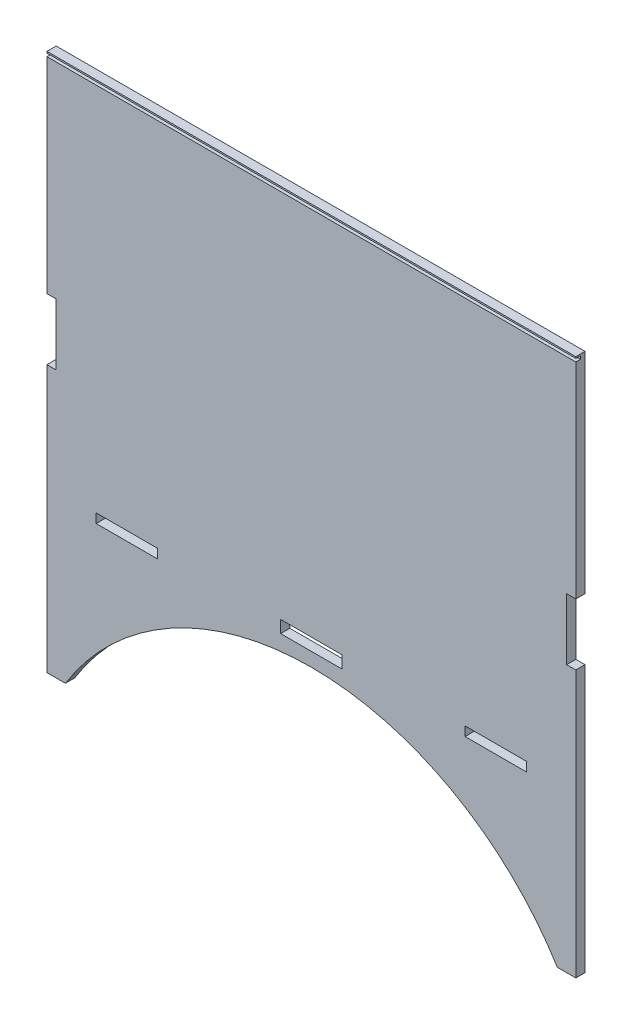
ISO-10303-21;
HEADER;
FILE_DESCRIPTION(('STEP AP214'),'2;1');
FILE_NAME('part.step','',(''),(''),'','','');
FILE_SCHEMA(('AUTOMOTIVE_DESIGN { 1 0 10303 214 1 1 1 1 }'));
ENDSEC;
DATA;
#1=APPLICATION_CONTEXT('core data for automotive mechanical design processes');
#2=APPLICATION_PROTOCOL_DEFINITION('international standard','automotive_design',2000,#1);
#3=PRODUCT_CONTEXT('',#1,'mechanical');
#4=PRODUCT('Part','Part','',(#3));
#5=PRODUCT_RELATED_PRODUCT_CATEGORY('part','',(#4));
#6=PRODUCT_DEFINITION_FORMATION('','',#4);
#7=PRODUCT_DEFINITION_CONTEXT('part definition',#1,'design');
#8=PRODUCT_DEFINITION('design','',#6,#7);
#9=PRODUCT_DEFINITION_SHAPE('','',#8);
#10=(LENGTH_UNIT() NAMED_UNIT(*) SI_UNIT(.MILLI.,.METRE.));
#11=(NAMED_UNIT(*) PLANE_ANGLE_UNIT() SI_UNIT($,.RADIAN.));
#12=(NAMED_UNIT(*) SI_UNIT($,.STERADIAN.) SOLID_ANGLE_UNIT());
#13=UNCERTAINTY_MEASURE_WITH_UNIT(LENGTH_MEASURE(1.E-05),#10,'distance_accuracy_value','');
#14=(GEOMETRIC_REPRESENTATION_CONTEXT(3) GLOBAL_UNCERTAINTY_ASSIGNED_CONTEXT((#13)) GLOBAL_UNIT_ASSIGNED_CONTEXT((#10,
#11,#12)) REPRESENTATION_CONTEXT('',''));
#15=CARTESIAN_POINT('',(0.,0.,0.));
#16=DIRECTION('',(0.,0.,1.));
#17=DIRECTION('',(1.,0.,0.));
#18=AXIS2_PLACEMENT_3D('',#15,#16,#17);
#19=CARTESIAN_POINT('',(-109.499197329278,-175.,3.));
#20=DIRECTION('',(1.,0.,0.));
#21=DIRECTION('',(0.,1.,0.));
#22=AXIS2_PLACEMENT_3D('',#19,#20,#21);
#23=PLANE('',#22);
#24=DIRECTION('',(0.,-1.,0.));
#25=VECTOR('',#24,1.);
#26=CARTESIAN_POINT('',(-109.499197329278,-175.,3.));
#27=LINE('',#26,#25);
#28=CARTESIAN_POINT('',(-109.499197329278,-88.25,3.));
#29=VERTEX_POINT('',#28);
#30=CARTESIAN_POINT('',(-109.499197329278,-175.,3.));
#31=VERTEX_POINT('',#30);
#32=EDGE_CURVE('E421',#29,#31,#27,.T.);
#33=ORIENTED_EDGE('',*,*,#32,.F.);
#34=DIRECTION('',(0.,0.,1.));
#35=VECTOR('',#34,1.);
#36=CARTESIAN_POINT('',(-109.499197329278,-88.25,0.));
#37=LINE('',#36,#35);
#38=CARTESIAN_POINT('',(-109.499197329278,-88.25,0.));
#39=VERTEX_POINT('',#38);
#40=EDGE_CURVE('E269',#39,#29,#37,.T.);
#41=ORIENTED_EDGE('',*,*,#40,.F.);
#42=DIRECTION('',(0.,-1.,0.));
#43=VECTOR('',#42,1.);
#44=CARTESIAN_POINT('',(-109.499197329278,-175.,0.));
#45=LINE('',#44,#43);
#46=CARTESIAN_POINT('',(-109.499197329278,-175.,0.));
#47=VERTEX_POINT('',#46);
#48=EDGE_CURVE('E260',#39,#47,#45,.T.);
#49=ORIENTED_EDGE('',*,*,#48,.T.);
#50=DIRECTION('',(0.,0.,-1.));
#51=VECTOR('',#50,1.);
#52=CARTESIAN_POINT('',(-109.499197329278,-175.,3.));
#53=LINE('',#52,#51);
#54=EDGE_CURVE('E11',#31,#47,#53,.T.);
#55=ORIENTED_EDGE('',*,*,#54,.F.);
#56=EDGE_LOOP('',(#33,#41,#49,#55));
#57=FACE_BOUND('',#56,.T.);
#58=ADVANCED_FACE('F39',(#57),#23,.F.);
#59=CARTESIAN_POINT('',(62.5008026707215,0.,3.));
#60=DIRECTION('',(-1.,0.,0.));
#61=DIRECTION('',(0.,-1.,0.));
#62=AXIS2_PLACEMENT_3D('',#59,#60,#61);
#63=PLANE('',#62);
#64=DIRECTION('',(0.,1.,0.));
#65=VECTOR('',#64,1.);
#66=CARTESIAN_POINT('',(62.5008026707215,0.,3.));
#67=LINE('',#66,#65);
#68=CARTESIAN_POINT('',(62.5008026707216,-68.25,3.));
#69=VERTEX_POINT('',#68);
#70=CARTESIAN_POINT('',(62.5008026707215,-1.50000000000006,3.));
#71=VERTEX_POINT('',#70);
#72=EDGE_CURVE('E432',#69,#71,#67,.T.);
#73=ORIENTED_EDGE('',*,*,#72,.F.);
#74=DIRECTION('',(0.,0.,1.));
#75=VECTOR('',#74,1.);
#76=CARTESIAN_POINT('',(62.5008026707216,-68.25,0.));
#77=LINE('',#76,#75);
#78=CARTESIAN_POINT('',(62.5008026707216,-68.25,0.));
#79=VERTEX_POINT('',#78);
#80=EDGE_CURVE('E282',#79,#69,#77,.T.);
#81=ORIENTED_EDGE('',*,*,#80,.F.);
#82=DIRECTION('',(0.,1.,0.));
#83=VECTOR('',#82,1.);
#84=CARTESIAN_POINT('',(62.5008026707215,0.,0.));
#85=LINE('',#84,#83);
#86=CARTESIAN_POINT('',(62.5008026707215,0.,0.));
#87=VERTEX_POINT('',#86);
#88=EDGE_CURVE('E444',#79,#87,#85,.T.);
#89=ORIENTED_EDGE('',*,*,#88,.T.);
#90=DIRECTION('',(0.,0.,-1.));
#91=VECTOR('',#90,1.);
#92=CARTESIAN_POINT('',(62.5008026707215,0.,3.));
#93=LINE('',#92,#91);
#94=CARTESIAN_POINT('',(62.5008026707215,0.,3.));
#95=VERTEX_POINT('',#94);
#96=EDGE_CURVE('E452',#95,#87,#93,.T.);
#97=ORIENTED_EDGE('',*,*,#96,.F.);
#98=CARTESIAN_POINT('',(62.5008026707215,-0.5,3.));
#99=VERTEX_POINT('',#98);
#100=EDGE_CURVE('E427',#99,#95,#67,.T.);
#101=ORIENTED_EDGE('',*,*,#100,.F.);
#102=DIRECTION('',(0.,0.,1.));
#103=VECTOR('',#102,1.);
#104=CARTESIAN_POINT('',(62.5008026707215,-0.5,1.5));
#105=LINE('',#104,#103);
#106=CARTESIAN_POINT('',(62.5008026707215,-0.5,1.5));
#107=VERTEX_POINT('',#106);
#108=EDGE_CURVE('E320',#107,#99,#105,.T.);
#109=ORIENTED_EDGE('',*,*,#108,.F.);
#110=DIRECTION('',(0.,1.,0.));
#111=VECTOR('',#110,1.);
#112=CARTESIAN_POINT('',(62.5008026707215,-1.50000000000006,1.5));
#113=LINE('',#112,#111);
#114=CARTESIAN_POINT('',(62.5008026707215,-1.50000000000007,1.5));
#115=VERTEX_POINT('',#114);
#116=EDGE_CURVE('E300',#115,#107,#113,.T.);
#117=ORIENTED_EDGE('',*,*,#116,.F.);
#118=DIRECTION('',(0.,0.,1.));
#119=VECTOR('',#118,1.);
#120=CARTESIAN_POINT('',(62.5008026707215,-1.50000000000006,1.5));
#121=LINE('',#120,#119);
#122=EDGE_CURVE('E310',#115,#71,#121,.T.);
#123=ORIENTED_EDGE('',*,*,#122,.T.);
#124=EDGE_LOOP('',(#73,#81,#89,#97,#101,#109,#117,#123));
#125=FACE_BOUND('',#124,.T.);
#126=ADVANCED_FACE('F508',(#125),#63,.F.);
#127=CARTESIAN_POINT('',(-23.4991973292784,-224.627916173612,3.));
#128=DIRECTION('',(0.,0.,-1.));
#129=DIRECTION('',(-1.,0.,0.));
#130=AXIS2_PLACEMENT_3D('',#127,#128,#129);
#131=PLANE('',#130);
#132=DIRECTION('',(0.,-1.,0.));
#133=VECTOR('',#132,1.);
#134=CARTESIAN_POINT('',(26.5008026707216,-122.,3.));
#135=LINE('',#134,#133);
#136=CARTESIAN_POINT('',(26.5008026707216,-122.,3.));
#137=VERTEX_POINT('',#136);
#138=CARTESIAN_POINT('',(26.5008026707216,-125.,3.));
#139=VERTEX_POINT('',#138);
#140=EDGE_CURVE('E324',#137,#139,#135,.T.);
#141=ORIENTED_EDGE('',*,*,#140,.F.);
#142=DIRECTION('',(-1.,0.,0.));
#143=VECTOR('',#142,1.);
#144=CARTESIAN_POINT('',(26.5008026707216,-122.,3.));
#145=LINE('',#144,#143);
#146=CARTESIAN_POINT('',(46.5008026707216,-122.,3.));
#147=VERTEX_POINT('',#146);
#148=EDGE_CURVE('E332',#147,#137,#145,.T.);
#149=ORIENTED_EDGE('',*,*,#148,.F.);
#150=DIRECTION('',(0.,1.,0.));
#151=VECTOR('',#150,1.);
#152=CARTESIAN_POINT('',(46.5008026707216,-122.,3.));
#153=LINE('',#152,#151);
#154=CARTESIAN_POINT('',(46.5008026707216,-125.,3.));
#155=VERTEX_POINT('',#154);
#156=EDGE_CURVE('E329',#155,#147,#153,.T.);
#157=ORIENTED_EDGE('',*,*,#156,.F.);
#158=DIRECTION('',(1.,0.,0.));
#159=VECTOR('',#158,1.);
#160=CARTESIAN_POINT('',(26.5008026707216,-125.,3.));
#161=LINE('',#160,#159);
#162=EDGE_CURVE('E326',#139,#155,#161,.T.);
#163=ORIENTED_EDGE('',*,*,#162,.F.);
#164=EDGE_LOOP('',(#141,#149,#157,#163));
#165=FACE_BOUND('',#164,.T.);
#166=DIRECTION('',(0.,-1.,0.));
#167=VECTOR('',#166,1.);
#168=CARTESIAN_POINT('',(-93.4991973292784,-122.,3.));
#169=LINE('',#168,#167);
#170=CARTESIAN_POINT('',(-93.4991973292784,-122.,3.));
#171=VERTEX_POINT('',#170);
#172=CARTESIAN_POINT('',(-93.4991973292784,-125.,3.));
#173=VERTEX_POINT('',#172);
#174=EDGE_CURVE('E386',#171,#173,#169,.T.);
#175=ORIENTED_EDGE('',*,*,#174,.F.);
#176=DIRECTION('',(-1.,0.,0.));
#177=VECTOR('',#176,1.);
#178=CARTESIAN_POINT('',(-93.4991973292784,-122.,3.));
#179=LINE('',#178,#177);
#180=CARTESIAN_POINT('',(-73.4991973292785,-122.,3.));
#181=VERTEX_POINT('',#180);
#182=EDGE_CURVE('E394',#181,#171,#179,.T.);
#183=ORIENTED_EDGE('',*,*,#182,.F.);
#184=DIRECTION('',(0.,1.,0.));
#185=VECTOR('',#184,1.);
#186=CARTESIAN_POINT('',(-73.4991973292785,-122.,3.));
#187=LINE('',#186,#185);
#188=CARTESIAN_POINT('',(-73.4991973292784,-125.,3.));
#189=VERTEX_POINT('',#188);
#190=EDGE_CURVE('E391',#189,#181,#187,.T.);
#191=ORIENTED_EDGE('',*,*,#190,.F.);
#192=DIRECTION('',(1.,0.,0.));
#193=VECTOR('',#192,1.);
#194=CARTESIAN_POINT('',(-93.4991973292784,-125.,3.));
#195=LINE('',#194,#193);
#196=EDGE_CURVE('E388',#173,#189,#195,.T.);
#197=ORIENTED_EDGE('',*,*,#196,.F.);
#198=EDGE_LOOP('',(#175,#183,#191,#197));
#199=FACE_BOUND('',#198,.T.);
#200=DIRECTION('',(0.,-1.,0.));
#201=VECTOR('',#200,1.);
#202=CARTESIAN_POINT('',(-33.4991973292784,-122.,3.));
#203=LINE('',#202,#201);
#204=CARTESIAN_POINT('',(-33.4991973292784,-122.,3.));
#205=VERTEX_POINT('',#204);
#206=CARTESIAN_POINT('',(-33.4991973292784,-126.,3.));
#207=VERTEX_POINT('',#206);
#208=EDGE_CURVE('E355',#205,#207,#203,.T.);
#209=ORIENTED_EDGE('',*,*,#208,.F.);
#210=DIRECTION('',(-1.,0.,0.));
#211=VECTOR('',#210,1.);
#212=CARTESIAN_POINT('',(-33.4991973292784,-122.,3.));
#213=LINE('',#212,#211);
#214=CARTESIAN_POINT('',(-13.4991973292784,-122.,3.));
#215=VERTEX_POINT('',#214);
#216=EDGE_CURVE('E363',#215,#205,#213,.T.);
#217=ORIENTED_EDGE('',*,*,#216,.F.);
#218=DIRECTION('',(0.,1.,0.));
#219=VECTOR('',#218,1.);
#220=CARTESIAN_POINT('',(-13.4991973292784,-122.,3.));
#221=LINE('',#220,#219);
#222=CARTESIAN_POINT('',(-13.4991973292784,-126.,3.));
#223=VERTEX_POINT('',#222);
#224=EDGE_CURVE('E360',#223,#215,#221,.T.);
#225=ORIENTED_EDGE('',*,*,#224,.F.);
#226=DIRECTION('',(1.,0.,0.));
#227=VECTOR('',#226,1.);
#228=CARTESIAN_POINT('',(-33.4991973292784,-126.,3.));
#229=LINE('',#228,#227);
#230=EDGE_CURVE('E357',#207,#223,#229,.T.);
#231=ORIENTED_EDGE('',*,*,#230,.F.);
#232=EDGE_LOOP('',(#209,#217,#225,#231));
#233=FACE_BOUND('',#232,.T.);
#234=DIRECTION('',(0.,1.,0.));
#235=VECTOR('',#234,1.);
#236=CARTESIAN_POINT('',(-106.499197329278,-88.25,3.));
#237=LINE('',#236,#235);
#238=CARTESIAN_POINT('',(-106.499197329278,-88.25,3.));
#239=VERTEX_POINT('',#238);
#240=CARTESIAN_POINT('',(-106.499197329278,-68.25,3.));
#241=VERTEX_POINT('',#240);
#242=EDGE_CURVE('E262',#239,#241,#237,.T.);
#243=ORIENTED_EDGE('',*,*,#242,.F.);
#244=DIRECTION('',(1.,0.,0.));
#245=VECTOR('',#244,1.);
#246=CARTESIAN_POINT('',(-109.499197329278,-88.25,3.));
#247=LINE('',#246,#245);
#248=EDGE_CURVE('E242',#29,#239,#247,.T.);
#249=ORIENTED_EDGE('',*,*,#248,.F.);
#250=ORIENTED_EDGE('',*,*,#32,.T.);
#251=DIRECTION('',(1.,0.,0.));
#252=VECTOR('',#251,1.);
#253=CARTESIAN_POINT('',(-109.499197329278,-175.,3.));
#254=LINE('',#253,#252);
#255=CARTESIAN_POINT('',(-103.499197329278,-175.,3.));
#256=VERTEX_POINT('',#255);
#257=EDGE_CURVE('E419',#31,#256,#254,.T.);
#258=ORIENTED_EDGE('',*,*,#257,.T.);
#259=CARTESIAN_POINT('',(-23.4991973292784,-224.627916173612,3.));
#260=DIRECTION('',(0.,0.,-1.));
#261=DIRECTION('',(-1.,0.,0.));
#262=AXIS2_PLACEMENT_3D('',#259,#260,#261);
#263=CIRCLE('',#262,94.1431360415356);
#264=CARTESIAN_POINT('',(56.5008026707216,-175.,3.));
#265=VERTEX_POINT('',#264);
#266=EDGE_CURVE('E423',#256,#265,#263,.T.);
#267=ORIENTED_EDGE('',*,*,#266,.T.);
#268=DIRECTION('',(1.,0.,0.));
#269=VECTOR('',#268,1.);
#270=CARTESIAN_POINT('',(56.5008026707216,-175.,3.));
#271=LINE('',#270,#269);
#272=CARTESIAN_POINT('',(62.5008026707216,-175.,3.));
#273=VERTEX_POINT('',#272);
#274=EDGE_CURVE('E425',#265,#273,#271,.T.);
#275=ORIENTED_EDGE('',*,*,#274,.T.);
#276=CARTESIAN_POINT('',(62.5008026707216,-88.25,3.));
#277=VERTEX_POINT('',#276);
#278=EDGE_CURVE('E428',#273,#277,#67,.T.);
#279=ORIENTED_EDGE('',*,*,#278,.T.);
#280=DIRECTION('',(1.,0.,0.));
#281=VECTOR('',#280,1.);
#282=CARTESIAN_POINT('',(62.5008026707216,-88.25,3.));
#283=LINE('',#282,#281);
#284=CARTESIAN_POINT('',(59.5008026707216,-88.25,3.));
#285=VERTEX_POINT('',#284);
#286=EDGE_CURVE('E62',#285,#277,#283,.T.);
#287=ORIENTED_EDGE('',*,*,#286,.F.);
#288=DIRECTION('',(0.,-1.,0.));
#289=VECTOR('',#288,1.);
#290=CARTESIAN_POINT('',(59.5008026707216,-88.25,3.));
#291=LINE('',#290,#289);
#292=CARTESIAN_POINT('',(59.5008026707216,-68.25,3.));
#293=VERTEX_POINT('',#292);
#294=EDGE_CURVE('E285',#293,#285,#291,.T.);
#295=ORIENTED_EDGE('',*,*,#294,.F.);
#296=DIRECTION('',(-1.,0.,0.));
#297=VECTOR('',#296,1.);
#298=CARTESIAN_POINT('',(62.5008026707216,-68.25,3.));
#299=LINE('',#298,#297);
#300=EDGE_CURVE('E267',#69,#293,#299,.T.);
#301=ORIENTED_EDGE('',*,*,#300,.F.);
#302=ORIENTED_EDGE('',*,*,#72,.T.);
#303=DIRECTION('',(1.,0.,0.));
#304=VECTOR('',#303,1.);
#305=CARTESIAN_POINT('',(-109.499197329278,-1.50000000000007,3.));
#306=LINE('',#305,#304);
#307=CARTESIAN_POINT('',(-109.499197329278,-1.50000000000007,3.));
#308=VERTEX_POINT('',#307);
#309=EDGE_CURVE('E271',#308,#71,#306,.T.);
#310=ORIENTED_EDGE('',*,*,#309,.F.);
#311=CARTESIAN_POINT('',(-109.499197329278,-68.25,3.));
#312=VERTEX_POINT('',#311);
#313=EDGE_CURVE('E420',#308,#312,#27,.T.);
#314=ORIENTED_EDGE('',*,*,#313,.T.);
#315=DIRECTION('',(-1.,0.,0.));
#316=VECTOR('',#315,1.);
#317=CARTESIAN_POINT('',(-109.499197329278,-68.25,3.));
#318=LINE('',#317,#316);
#319=EDGE_CURVE('E54',#241,#312,#318,.T.);
#320=ORIENTED_EDGE('',*,*,#319,.F.);
#321=EDGE_LOOP('',(#243,#249,#250,#258,#267,#275,#279,#287,#295,#301,#302,#310,#314,#320));
#322=FACE_BOUND('',#321,.T.);
#323=ADVANCED_FACE('F479',(#165,#199,#233,#322),#131,.F.);
#324=CARTESIAN_POINT('',(-109.499197329278,0.,3.));
#325=VERTEX_POINT('',#324);
#326=CARTESIAN_POINT('',(-109.499197329278,-0.5,3.));
#327=VERTEX_POINT('',#326);
#328=EDGE_CURVE('E416',#325,#327,#27,.T.);
#329=ORIENTED_EDGE('',*,*,#328,.T.);
#330=DIRECTION('',(-1.,0.,0.));
#331=VECTOR('',#330,1.);
#332=CARTESIAN_POINT('',(-109.499197329278,-0.5,3.));
#333=LINE('',#332,#331);
#334=EDGE_CURVE('E301',#99,#327,#333,.T.);
#335=ORIENTED_EDGE('',*,*,#334,.F.);
#336=ORIENTED_EDGE('',*,*,#100,.T.);
#337=DIRECTION('',(-1.,0.,0.));
#338=VECTOR('',#337,1.);
#339=CARTESIAN_POINT('',(-109.499197329278,0.,3.));
#340=LINE('',#339,#338);
#341=EDGE_CURVE('E431',#95,#325,#340,.T.);
#342=ORIENTED_EDGE('',*,*,#341,.T.);
#343=EDGE_LOOP('',(#329,#335,#336,#342));
#344=FACE_BOUND('',#343,.T.);
#345=ADVANCED_FACE('F503',(#344),#131,.F.);
#346=CARTESIAN_POINT('',(-23.4991973292784,-224.627916173612,0.));
#347=DIRECTION('',(0.,0.,-1.));
#348=DIRECTION('',(-1.,0.,0.));
#349=AXIS2_PLACEMENT_3D('',#346,#347,#348);
#350=PLANE('',#349);
#351=DIRECTION('',(1.,0.,0.));
#352=VECTOR('',#351,1.);
#353=CARTESIAN_POINT('',(-109.499197329278,-88.25,0.));
#354=LINE('',#353,#352);
#355=CARTESIAN_POINT('',(-106.499197329278,-88.25,0.));
#356=VERTEX_POINT('',#355);
#357=EDGE_CURVE('E239',#39,#356,#354,.T.);
#358=ORIENTED_EDGE('',*,*,#357,.T.);
#359=DIRECTION('',(0.,1.,0.));
#360=VECTOR('',#359,1.);
#361=CARTESIAN_POINT('',(-106.499197329278,-88.25,0.));
#362=LINE('',#361,#360);
#363=CARTESIAN_POINT('',(-106.499197329278,-68.25,0.));
#364=VERTEX_POINT('',#363);
#365=EDGE_CURVE('E250',#356,#364,#362,.T.);
#366=ORIENTED_EDGE('',*,*,#365,.T.);
#367=DIRECTION('',(-1.,0.,0.));
#368=VECTOR('',#367,1.);
#369=CARTESIAN_POINT('',(-109.499197329278,-68.25,0.));
#370=LINE('',#369,#368);
#371=CARTESIAN_POINT('',(-109.499197329278,-68.25,0.));
#372=VERTEX_POINT('',#371);
#373=EDGE_CURVE('E247',#364,#372,#370,.T.);
#374=ORIENTED_EDGE('',*,*,#373,.T.);
#375=CARTESIAN_POINT('',(-109.499197329278,0.,0.));
#376=VERTEX_POINT('',#375);
#377=EDGE_CURVE('E435',#376,#372,#45,.T.);
#378=ORIENTED_EDGE('',*,*,#377,.F.);
#379=DIRECTION('',(-1.,0.,0.));
#380=VECTOR('',#379,1.);
#381=CARTESIAN_POINT('',(-109.499197329278,0.,0.));
#382=LINE('',#381,#380);
#383=EDGE_CURVE('E448',#87,#376,#382,.T.);
#384=ORIENTED_EDGE('',*,*,#383,.F.);
#385=ORIENTED_EDGE('',*,*,#88,.F.);
#386=DIRECTION('',(-1.,0.,0.));
#387=VECTOR('',#386,1.);
#388=CARTESIAN_POINT('',(62.5008026707216,-68.25,0.));
#389=LINE('',#388,#387);
#390=CARTESIAN_POINT('',(59.5008026707216,-68.25,0.));
#391=VERTEX_POINT('',#390);
#392=EDGE_CURVE('E286',#79,#391,#389,.T.);
#393=ORIENTED_EDGE('',*,*,#392,.T.);
#394=DIRECTION('',(0.,-1.,0.));
#395=VECTOR('',#394,1.);
#396=CARTESIAN_POINT('',(59.5008026707216,-88.25,0.));
#397=LINE('',#396,#395);
#398=CARTESIAN_POINT('',(59.5008026707216,-88.25,0.));
#399=VERTEX_POINT('',#398);
#400=EDGE_CURVE('E293',#391,#399,#397,.T.);
#401=ORIENTED_EDGE('',*,*,#400,.T.);
#402=DIRECTION('',(1.,0.,0.));
#403=VECTOR('',#402,1.);
#404=CARTESIAN_POINT('',(62.5008026707216,-88.25,0.));
#405=LINE('',#404,#403);
#406=CARTESIAN_POINT('',(62.5008026707216,-88.25,0.));
#407=VERTEX_POINT('',#406);
#408=EDGE_CURVE('E277',#399,#407,#405,.T.);
#409=ORIENTED_EDGE('',*,*,#408,.T.);
#410=CARTESIAN_POINT('',(62.5008026707216,-175.,0.));
#411=VERTEX_POINT('',#410);
#412=EDGE_CURVE('E445',#411,#407,#85,.T.);
#413=ORIENTED_EDGE('',*,*,#412,.F.);
#414=DIRECTION('',(1.,0.,0.));
#415=VECTOR('',#414,1.);
#416=CARTESIAN_POINT('',(56.5008026707216,-175.,0.));
#417=LINE('',#416,#415);
#418=CARTESIAN_POINT('',(56.5008026707216,-175.,0.));
#419=VERTEX_POINT('',#418);
#420=EDGE_CURVE('E442',#419,#411,#417,.T.);
#421=ORIENTED_EDGE('',*,*,#420,.F.);
#422=CARTESIAN_POINT('',(-23.4991973292784,-224.627916173612,0.));
#423=DIRECTION('',(0.,0.,-1.));
#424=DIRECTION('',(-1.,0.,0.));
#425=AXIS2_PLACEMENT_3D('',#422,#423,#424);
#426=CIRCLE('',#425,94.1431360415356);
#427=CARTESIAN_POINT('',(-103.499197329278,-175.,0.));
#428=VERTEX_POINT('',#427);
#429=EDGE_CURVE('E440',#428,#419,#426,.T.);
#430=ORIENTED_EDGE('',*,*,#429,.F.);
#431=DIRECTION('',(1.,0.,0.));
#432=VECTOR('',#431,1.);
#433=CARTESIAN_POINT('',(-109.499197329278,-175.,0.));
#434=LINE('',#433,#432);
#435=EDGE_CURVE('E438',#47,#428,#434,.T.);
#436=ORIENTED_EDGE('',*,*,#435,.F.);
#437=ORIENTED_EDGE('',*,*,#48,.F.);
#438=EDGE_LOOP('',(#358,#366,#374,#378,#384,#385,#393,#401,#409,#413,#421,#430,#436,#437));
#439=FACE_BOUND('',#438,.T.);
#440=DIRECTION('',(-1.,0.,0.));
#441=VECTOR('',#440,1.);
#442=CARTESIAN_POINT('',(-93.4991973292784,-122.,0.));
#443=LINE('',#442,#441);
#444=CARTESIAN_POINT('',(-73.4991973292785,-122.,0.));
#445=VERTEX_POINT('',#444);
#446=CARTESIAN_POINT('',(-93.4991973292784,-122.,0.));
#447=VERTEX_POINT('',#446);
#448=EDGE_CURVE('E389',#445,#447,#443,.T.);
#449=ORIENTED_EDGE('',*,*,#448,.T.);
#450=DIRECTION('',(0.,-1.,0.));
#451=VECTOR('',#450,1.);
#452=CARTESIAN_POINT('',(-93.4991973292784,-122.,0.));
#453=LINE('',#452,#451);
#454=CARTESIAN_POINT('',(-93.4991973292784,-125.,0.));
#455=VERTEX_POINT('',#454);
#456=EDGE_CURVE('E385',#447,#455,#453,.T.);
#457=ORIENTED_EDGE('',*,*,#456,.T.);
#458=DIRECTION('',(1.,0.,0.));
#459=VECTOR('',#458,1.);
#460=CARTESIAN_POINT('',(-93.4991973292784,-125.,0.));
#461=LINE('',#460,#459);
#462=CARTESIAN_POINT('',(-73.4991973292784,-125.,0.));
#463=VERTEX_POINT('',#462);
#464=EDGE_CURVE('E399',#455,#463,#461,.T.);
#465=ORIENTED_EDGE('',*,*,#464,.T.);
#466=DIRECTION('',(0.,1.,0.));
#467=VECTOR('',#466,1.);
#468=CARTESIAN_POINT('',(-73.4991973292785,-122.,0.));
#469=LINE('',#468,#467);
#470=EDGE_CURVE('E402',#463,#445,#469,.T.);
#471=ORIENTED_EDGE('',*,*,#470,.T.);
#472=EDGE_LOOP('',(#449,#457,#465,#471));
#473=FACE_BOUND('',#472,.T.);
#474=DIRECTION('',(-1.,0.,0.));
#475=VECTOR('',#474,1.);
#476=CARTESIAN_POINT('',(-33.4991973292784,-122.,0.));
#477=LINE('',#476,#475);
#478=CARTESIAN_POINT('',(-13.4991973292784,-122.,0.));
#479=VERTEX_POINT('',#478);
#480=CARTESIAN_POINT('',(-33.4991973292784,-122.,0.));
#481=VERTEX_POINT('',#480);
#482=EDGE_CURVE('E358',#479,#481,#477,.T.);
#483=ORIENTED_EDGE('',*,*,#482,.T.);
#484=DIRECTION('',(0.,-1.,0.));
#485=VECTOR('',#484,1.);
#486=CARTESIAN_POINT('',(-33.4991973292784,-122.,0.));
#487=LINE('',#486,#485);
#488=CARTESIAN_POINT('',(-33.4991973292784,-126.,0.));
#489=VERTEX_POINT('',#488);
#490=EDGE_CURVE('E354',#481,#489,#487,.T.);
#491=ORIENTED_EDGE('',*,*,#490,.T.);
#492=DIRECTION('',(1.,0.,0.));
#493=VECTOR('',#492,1.);
#494=CARTESIAN_POINT('',(-33.4991973292784,-126.,0.));
#495=LINE('',#494,#493);
#496=CARTESIAN_POINT('',(-13.4991973292784,-126.,0.));
#497=VERTEX_POINT('',#496);
#498=EDGE_CURVE('E368',#489,#497,#495,.T.);
#499=ORIENTED_EDGE('',*,*,#498,.T.);
#500=DIRECTION('',(0.,1.,0.));
#501=VECTOR('',#500,1.);
#502=CARTESIAN_POINT('',(-13.4991973292784,-122.,0.));
#503=LINE('',#502,#501);
#504=EDGE_CURVE('E371',#497,#479,#503,.T.);
#505=ORIENTED_EDGE('',*,*,#504,.T.);
#506=EDGE_LOOP('',(#483,#491,#499,#505));
#507=FACE_BOUND('',#506,.T.);
#508=DIRECTION('',(-1.,0.,0.));
#509=VECTOR('',#508,1.);
#510=CARTESIAN_POINT('',(26.5008026707216,-122.,0.));
#511=LINE('',#510,#509);
#512=CARTESIAN_POINT('',(46.5008026707216,-122.,0.));
#513=VERTEX_POINT('',#512);
#514=CARTESIAN_POINT('',(26.5008026707216,-122.,0.));
#515=VERTEX_POINT('',#514);
#516=EDGE_CURVE('E327',#513,#515,#511,.T.);
#517=ORIENTED_EDGE('',*,*,#516,.T.);
#518=DIRECTION('',(0.,-1.,0.));
#519=VECTOR('',#518,1.);
#520=CARTESIAN_POINT('',(26.5008026707216,-122.,0.));
#521=LINE('',#520,#519);
#522=CARTESIAN_POINT('',(26.5008026707216,-125.,0.));
#523=VERTEX_POINT('',#522);
#524=EDGE_CURVE('E316',#515,#523,#521,.T.);
#525=ORIENTED_EDGE('',*,*,#524,.T.);
#526=DIRECTION('',(1.,0.,0.));
#527=VECTOR('',#526,1.);
#528=CARTESIAN_POINT('',(26.5008026707216,-125.,0.));
#529=LINE('',#528,#527);
#530=CARTESIAN_POINT('',(46.5008026707216,-125.,0.));
#531=VERTEX_POINT('',#530);
#532=EDGE_CURVE('E337',#523,#531,#529,.T.);
#533=ORIENTED_EDGE('',*,*,#532,.T.);
#534=DIRECTION('',(0.,1.,0.));
#535=VECTOR('',#534,1.);
#536=CARTESIAN_POINT('',(46.5008026707216,-122.,0.));
#537=LINE('',#536,#535);
#538=EDGE_CURVE('E340',#531,#513,#537,.T.);
#539=ORIENTED_EDGE('',*,*,#538,.T.);
#540=EDGE_LOOP('',(#517,#525,#533,#539));
#541=FACE_BOUND('',#540,.T.);
#542=ADVANCED_FACE('F257',(#439,#473,#507,#541),#350,.T.);
#543=ORIENTED_EDGE('',*,*,#377,.T.);
#544=DIRECTION('',(0.,0.,1.));
#545=VECTOR('',#544,1.);
#546=CARTESIAN_POINT('',(-109.499197329278,-68.25,0.));
#547=LINE('',#546,#545);
#548=EDGE_CURVE('E272',#372,#312,#547,.T.);
#549=ORIENTED_EDGE('',*,*,#548,.T.);
#550=ORIENTED_EDGE('',*,*,#313,.F.);
#551=DIRECTION('',(0.,0.,1.));
#552=VECTOR('',#551,1.);
#553=CARTESIAN_POINT('',(-109.499197329278,-1.50000000000007,1.5));
#554=LINE('',#553,#552);
#555=CARTESIAN_POINT('',(-109.499197329278,-1.50000000000007,1.5));
#556=VERTEX_POINT('',#555);
#557=EDGE_CURVE('E314',#556,#308,#554,.T.);
#558=ORIENTED_EDGE('',*,*,#557,.F.);
#559=DIRECTION('',(0.,-1.,0.));
#560=VECTOR('',#559,1.);
#561=CARTESIAN_POINT('',(-109.499197329278,-1.50000000000007,1.5));
#562=LINE('',#561,#560);
#563=CARTESIAN_POINT('',(-109.499197329278,-0.5,1.5));
#564=VERTEX_POINT('',#563);
#565=EDGE_CURVE('E307',#564,#556,#562,.T.);
#566=ORIENTED_EDGE('',*,*,#565,.F.);
#567=DIRECTION('',(0.,0.,1.));
#568=VECTOR('',#567,1.);
#569=CARTESIAN_POINT('',(-109.499197329278,-0.5,1.5));
#570=LINE('',#569,#568);
#571=EDGE_CURVE('E317',#564,#327,#570,.T.);
#572=ORIENTED_EDGE('',*,*,#571,.T.);
#573=ORIENTED_EDGE('',*,*,#328,.F.);
#574=DIRECTION('',(0.,0.,-1.));
#575=VECTOR('',#574,1.);
#576=CARTESIAN_POINT('',(-109.499197329278,0.,3.));
#577=LINE('',#576,#575);
#578=EDGE_CURVE('E434',#325,#376,#577,.T.);
#579=ORIENTED_EDGE('',*,*,#578,.T.);
#580=EDGE_LOOP('',(#543,#549,#550,#558,#566,#572,#573,#579));
#581=FACE_BOUND('',#580,.T.);
#582=ADVANCED_FACE('F41',(#581),#23,.F.);
#583=CARTESIAN_POINT('',(-109.499197329278,-175.,3.));
#584=DIRECTION('',(0.,1.,0.));
#585=DIRECTION('',(0.,0.,1.));
#586=AXIS2_PLACEMENT_3D('',#583,#584,#585);
#587=PLANE('',#586);
#588=ORIENTED_EDGE('',*,*,#435,.T.);
#589=DIRECTION('',(0.,0.,-1.));
#590=VECTOR('',#589,1.);
#591=CARTESIAN_POINT('',(-103.499197329278,-175.,3.));
#592=LINE('',#591,#590);
#593=EDGE_CURVE('E47',#256,#428,#592,.T.);
#594=ORIENTED_EDGE('',*,*,#593,.F.);
#595=ORIENTED_EDGE('',*,*,#257,.F.);
#596=ORIENTED_EDGE('',*,*,#54,.T.);
#597=EDGE_LOOP('',(#588,#594,#595,#596));
#598=FACE_BOUND('',#597,.T.);
#599=ADVANCED_FACE('F483',(#598),#587,.F.);
#600=CARTESIAN_POINT('',(-23.4991973292784,-224.627916173612,3.));
#601=DIRECTION('',(0.,0.,-1.));
#602=DIRECTION('',(-1.,0.,0.));
#603=AXIS2_PLACEMENT_3D('',#600,#601,#602);
#604=CYLINDRICAL_SURFACE('',#603,94.1431360415356);
#605=ORIENTED_EDGE('',*,*,#429,.T.);
#606=DIRECTION('',(0.,0.,-1.));
#607=VECTOR('',#606,1.);
#608=CARTESIAN_POINT('',(56.5008026707216,-175.,3.));
#609=LINE('',#608,#607);
#610=EDGE_CURVE('E458',#265,#419,#609,.T.);
#611=ORIENTED_EDGE('',*,*,#610,.F.);
#612=ORIENTED_EDGE('',*,*,#266,.F.);
#613=ORIENTED_EDGE('',*,*,#593,.T.);
#614=EDGE_LOOP('',(#605,#611,#612,#613));
#615=FACE_BOUND('',#614,.T.);
#616=ADVANCED_FACE('F465',(#615),#604,.F.);
#617=CARTESIAN_POINT('',(56.5008026707216,-175.,3.));
#618=DIRECTION('',(0.,1.,0.));
#619=DIRECTION('',(0.,0.,1.));
#620=AXIS2_PLACEMENT_3D('',#617,#618,#619);
#621=PLANE('',#620);
#622=ORIENTED_EDGE('',*,*,#420,.T.);
#623=DIRECTION('',(0.,0.,-1.));
#624=VECTOR('',#623,1.);
#625=CARTESIAN_POINT('',(62.5008026707216,-175.,3.));
#626=LINE('',#625,#624);
#627=EDGE_CURVE('E455',#273,#411,#626,.T.);
#628=ORIENTED_EDGE('',*,*,#627,.F.);
#629=ORIENTED_EDGE('',*,*,#274,.F.);
#630=ORIENTED_EDGE('',*,*,#610,.T.);
#631=EDGE_LOOP('',(#622,#628,#629,#630));
#632=FACE_BOUND('',#631,.T.);
#633=ADVANCED_FACE('F473',(#632),#621,.F.);
#634=ORIENTED_EDGE('',*,*,#412,.T.);
#635=DIRECTION('',(0.,0.,1.));
#636=VECTOR('',#635,1.);
#637=CARTESIAN_POINT('',(62.5008026707216,-88.25,0.));
#638=LINE('',#637,#636);
#639=EDGE_CURVE('E280',#407,#277,#638,.T.);
#640=ORIENTED_EDGE('',*,*,#639,.T.);
#641=ORIENTED_EDGE('',*,*,#278,.F.);
#642=ORIENTED_EDGE('',*,*,#627,.T.);
#643=EDGE_LOOP('',(#634,#640,#641,#642));
#644=FACE_BOUND('',#643,.T.);
#645=ADVANCED_FACE('F477',(#644),#63,.F.);
#646=CARTESIAN_POINT('',(-109.499197329278,0.,3.));
#647=DIRECTION('',(0.,-1.,0.));
#648=DIRECTION('',(0.,0.,-1.));
#649=AXIS2_PLACEMENT_3D('',#646,#647,#648);
#650=PLANE('',#649);
#651=ORIENTED_EDGE('',*,*,#383,.T.);
#652=ORIENTED_EDGE('',*,*,#578,.F.);
#653=ORIENTED_EDGE('',*,*,#341,.F.);
#654=ORIENTED_EDGE('',*,*,#96,.T.);
#655=EDGE_LOOP('',(#651,#652,#653,#654));
#656=FACE_BOUND('',#655,.T.);
#657=ADVANCED_FACE('F497',(#656),#650,.F.);
#658=CARTESIAN_POINT('',(-93.4991973292784,-122.,3.));
#659=DIRECTION('',(1.,0.,0.));
#660=DIRECTION('',(0.,0.,-1.));
#661=AXIS2_PLACEMENT_3D('',#658,#659,#660);
#662=PLANE('',#661);
#663=ORIENTED_EDGE('',*,*,#456,.F.);
#664=DIRECTION('',(0.,0.,-1.));
#665=VECTOR('',#664,1.);
#666=CARTESIAN_POINT('',(-93.4991973292784,-122.,3.));
#667=LINE('',#666,#665);
#668=EDGE_CURVE('E396',#171,#447,#667,.T.);
#669=ORIENTED_EDGE('',*,*,#668,.F.);
#670=ORIENTED_EDGE('',*,*,#174,.T.);
#671=DIRECTION('',(0.,0.,-1.));
#672=VECTOR('',#671,1.);
#673=CARTESIAN_POINT('',(-93.4991973292784,-125.,3.));
#674=LINE('',#673,#672);
#675=EDGE_CURVE('E413',#173,#455,#674,.T.);
#676=ORIENTED_EDGE('',*,*,#675,.T.);
#677=EDGE_LOOP('',(#663,#669,#670,#676));
#678=FACE_BOUND('',#677,.T.);
#679=ADVANCED_FACE('F549',(#678),#662,.T.);
#680=CARTESIAN_POINT('',(-93.4991973292784,-125.,3.));
#681=DIRECTION('',(0.,1.,0.));
#682=DIRECTION('',(0.,0.,1.));
#683=AXIS2_PLACEMENT_3D('',#680,#681,#682);
#684=PLANE('',#683);
#685=ORIENTED_EDGE('',*,*,#464,.F.);
#686=ORIENTED_EDGE('',*,*,#675,.F.);
#687=ORIENTED_EDGE('',*,*,#196,.T.);
#688=DIRECTION('',(0.,0.,-1.));
#689=VECTOR('',#688,1.);
#690=CARTESIAN_POINT('',(-73.4991973292784,-125.,3.));
#691=LINE('',#690,#689);
#692=EDGE_CURVE('E411',#189,#463,#691,.T.);
#693=ORIENTED_EDGE('',*,*,#692,.T.);
#694=EDGE_LOOP('',(#685,#686,#687,#693));
#695=FACE_BOUND('',#694,.T.);
#696=ADVANCED_FACE('F576',(#695),#684,.T.);
#697=CARTESIAN_POINT('',(-73.4991973292785,-122.,3.));
#698=DIRECTION('',(-1.,0.,0.));
#699=DIRECTION('',(0.,-1.,0.));
#700=AXIS2_PLACEMENT_3D('',#697,#698,#699);
#701=PLANE('',#700);
#702=ORIENTED_EDGE('',*,*,#470,.F.);
#703=ORIENTED_EDGE('',*,*,#692,.F.);
#704=ORIENTED_EDGE('',*,*,#190,.T.);
#705=DIRECTION('',(0.,0.,-1.));
#706=VECTOR('',#705,1.);
#707=CARTESIAN_POINT('',(-73.4991973292785,-122.,3.));
#708=LINE('',#707,#706);
#709=EDGE_CURVE('E409',#181,#445,#708,.T.);
#710=ORIENTED_EDGE('',*,*,#709,.T.);
#711=EDGE_LOOP('',(#702,#703,#704,#710));
#712=FACE_BOUND('',#711,.T.);
#713=ADVANCED_FACE('F584',(#712),#701,.T.);
#714=CARTESIAN_POINT('',(-93.4991973292784,-122.,3.));
#715=DIRECTION('',(0.,-1.,0.));
#716=DIRECTION('',(1.,0.,0.));
#717=AXIS2_PLACEMENT_3D('',#714,#715,#716);
#718=PLANE('',#717);
#719=ORIENTED_EDGE('',*,*,#448,.F.);
#720=ORIENTED_EDGE('',*,*,#709,.F.);
#721=ORIENTED_EDGE('',*,*,#182,.T.);
#722=ORIENTED_EDGE('',*,*,#668,.T.);
#723=EDGE_LOOP('',(#719,#720,#721,#722));
#724=FACE_BOUND('',#723,.T.);
#725=ADVANCED_FACE('F593',(#724),#718,.T.);
#726=CARTESIAN_POINT('',(-33.4991973292784,-122.,3.));
#727=DIRECTION('',(1.,0.,0.));
#728=DIRECTION('',(0.,0.,-1.));
#729=AXIS2_PLACEMENT_3D('',#726,#727,#728);
#730=PLANE('',#729);
#731=ORIENTED_EDGE('',*,*,#490,.F.);
#732=DIRECTION('',(0.,0.,-1.));
#733=VECTOR('',#732,1.);
#734=CARTESIAN_POINT('',(-33.4991973292784,-122.,3.));
#735=LINE('',#734,#733);
#736=EDGE_CURVE('E365',#205,#481,#735,.T.);
#737=ORIENTED_EDGE('',*,*,#736,.F.);
#738=ORIENTED_EDGE('',*,*,#208,.T.);
#739=DIRECTION('',(0.,0.,-1.));
#740=VECTOR('',#739,1.);
#741=CARTESIAN_POINT('',(-33.4991973292784,-126.,3.));
#742=LINE('',#741,#740);
#743=EDGE_CURVE('E382',#207,#489,#742,.T.);
#744=ORIENTED_EDGE('',*,*,#743,.T.);
#745=EDGE_LOOP('',(#731,#737,#738,#744));
#746=FACE_BOUND('',#745,.T.);
#747=ADVANCED_FACE('F602',(#746),#730,.T.);
#748=CARTESIAN_POINT('',(-33.4991973292784,-126.,3.));
#749=DIRECTION('',(0.,1.,0.));
#750=DIRECTION('',(0.,0.,1.));
#751=AXIS2_PLACEMENT_3D('',#748,#749,#750);
#752=PLANE('',#751);
#753=ORIENTED_EDGE('',*,*,#498,.F.);
#754=ORIENTED_EDGE('',*,*,#743,.F.);
#755=ORIENTED_EDGE('',*,*,#230,.T.);
#756=DIRECTION('',(0.,0.,-1.));
#757=VECTOR('',#756,1.);
#758=CARTESIAN_POINT('',(-13.4991973292784,-126.,3.));
#759=LINE('',#758,#757);
#760=EDGE_CURVE('E380',#223,#497,#759,.T.);
#761=ORIENTED_EDGE('',*,*,#760,.T.);
#762=EDGE_LOOP('',(#753,#754,#755,#761));
#763=FACE_BOUND('',#762,.T.);
#764=ADVANCED_FACE('F611',(#763),#752,.T.);
#765=CARTESIAN_POINT('',(-13.4991973292784,-122.,3.));
#766=DIRECTION('',(-1.,0.,0.));
#767=DIRECTION('',(0.,-1.,0.));
#768=AXIS2_PLACEMENT_3D('',#765,#766,#767);
#769=PLANE('',#768);
#770=ORIENTED_EDGE('',*,*,#504,.F.);
#771=ORIENTED_EDGE('',*,*,#760,.F.);
#772=ORIENTED_EDGE('',*,*,#224,.T.);
#773=DIRECTION('',(0.,0.,-1.));
#774=VECTOR('',#773,1.);
#775=CARTESIAN_POINT('',(-13.4991973292784,-122.,3.));
#776=LINE('',#775,#774);
#777=EDGE_CURVE('E378',#215,#479,#776,.T.);
#778=ORIENTED_EDGE('',*,*,#777,.T.);
#779=EDGE_LOOP('',(#770,#771,#772,#778));
#780=FACE_BOUND('',#779,.T.);
#781=ADVANCED_FACE('F620',(#780),#769,.T.);
#782=CARTESIAN_POINT('',(-33.4991973292784,-122.,3.));
#783=DIRECTION('',(0.,-1.,0.));
#784=DIRECTION('',(0.,0.,-1.));
#785=AXIS2_PLACEMENT_3D('',#782,#783,#784);
#786=PLANE('',#785);
#787=ORIENTED_EDGE('',*,*,#482,.F.);
#788=ORIENTED_EDGE('',*,*,#777,.F.);
#789=ORIENTED_EDGE('',*,*,#216,.T.);
#790=ORIENTED_EDGE('',*,*,#736,.T.);
#791=EDGE_LOOP('',(#787,#788,#789,#790));
#792=FACE_BOUND('',#791,.T.);
#793=ADVANCED_FACE('F629',(#792),#786,.T.);
#794=CARTESIAN_POINT('',(26.5008026707216,-122.,3.));
#795=DIRECTION('',(1.,0.,0.));
#796=DIRECTION('',(0.,0.,-1.));
#797=AXIS2_PLACEMENT_3D('',#794,#795,#796);
#798=PLANE('',#797);
#799=ORIENTED_EDGE('',*,*,#524,.F.);
#800=DIRECTION('',(0.,0.,-1.));
#801=VECTOR('',#800,1.);
#802=CARTESIAN_POINT('',(26.5008026707216,-122.,3.));
#803=LINE('',#802,#801);
#804=EDGE_CURVE('E334',#137,#515,#803,.T.);
#805=ORIENTED_EDGE('',*,*,#804,.F.);
#806=ORIENTED_EDGE('',*,*,#140,.T.);
#807=DIRECTION('',(0.,0.,-1.));
#808=VECTOR('',#807,1.);
#809=CARTESIAN_POINT('',(26.5008026707216,-125.,3.));
#810=LINE('',#809,#808);
#811=EDGE_CURVE('E351',#139,#523,#810,.T.);
#812=ORIENTED_EDGE('',*,*,#811,.T.);
#813=EDGE_LOOP('',(#799,#805,#806,#812));
#814=FACE_BOUND('',#813,.T.);
#815=ADVANCED_FACE('F638',(#814),#798,.T.);
#816=CARTESIAN_POINT('',(26.5008026707216,-125.,3.));
#817=DIRECTION('',(0.,1.,0.));
#818=DIRECTION('',(0.,0.,1.));
#819=AXIS2_PLACEMENT_3D('',#816,#817,#818);
#820=PLANE('',#819);
#821=ORIENTED_EDGE('',*,*,#532,.F.);
#822=ORIENTED_EDGE('',*,*,#811,.F.);
#823=ORIENTED_EDGE('',*,*,#162,.T.);
#824=DIRECTION('',(0.,0.,-1.));
#825=VECTOR('',#824,1.);
#826=CARTESIAN_POINT('',(46.5008026707216,-125.,3.));
#827=LINE('',#826,#825);
#828=EDGE_CURVE('E349',#155,#531,#827,.T.);
#829=ORIENTED_EDGE('',*,*,#828,.T.);
#830=EDGE_LOOP('',(#821,#822,#823,#829));
#831=FACE_BOUND('',#830,.T.);
#832=ADVANCED_FACE('F647',(#831),#820,.T.);
#833=CARTESIAN_POINT('',(46.5008026707216,-122.,3.));
#834=DIRECTION('',(-1.,0.,0.));
#835=DIRECTION('',(0.,0.,1.));
#836=AXIS2_PLACEMENT_3D('',#833,#834,#835);
#837=PLANE('',#836);
#838=ORIENTED_EDGE('',*,*,#538,.F.);
#839=ORIENTED_EDGE('',*,*,#828,.F.);
#840=ORIENTED_EDGE('',*,*,#156,.T.);
#841=DIRECTION('',(0.,0.,-1.));
#842=VECTOR('',#841,1.);
#843=CARTESIAN_POINT('',(46.5008026707216,-122.,3.));
#844=LINE('',#843,#842);
#845=EDGE_CURVE('E347',#147,#513,#844,.T.);
#846=ORIENTED_EDGE('',*,*,#845,.T.);
#847=EDGE_LOOP('',(#838,#839,#840,#846));
#848=FACE_BOUND('',#847,.T.);
#849=ADVANCED_FACE('F656',(#848),#837,.T.);
#850=CARTESIAN_POINT('',(26.5008026707216,-122.,3.));
#851=DIRECTION('',(0.,-1.,0.));
#852=DIRECTION('',(0.,0.,-1.));
#853=AXIS2_PLACEMENT_3D('',#850,#851,#852);
#854=PLANE('',#853);
#855=ORIENTED_EDGE('',*,*,#516,.F.);
#856=ORIENTED_EDGE('',*,*,#845,.F.);
#857=ORIENTED_EDGE('',*,*,#148,.T.);
#858=ORIENTED_EDGE('',*,*,#804,.T.);
#859=EDGE_LOOP('',(#855,#856,#857,#858));
#860=FACE_BOUND('',#859,.T.);
#861=ADVANCED_FACE('F665',(#860),#854,.T.);
#862=CARTESIAN_POINT('',(-109.499197329278,-1.50000000000007,1.5));
#863=DIRECTION('',(0.,-1.,0.));
#864=DIRECTION('',(1.,0.,0.));
#865=AXIS2_PLACEMENT_3D('',#862,#863,#864);
#866=PLANE('',#865);
#867=ORIENTED_EDGE('',*,*,#309,.T.);
#868=ORIENTED_EDGE('',*,*,#122,.F.);
#869=DIRECTION('',(1.,0.,0.));
#870=VECTOR('',#869,1.);
#871=CARTESIAN_POINT('',(-109.499197329278,-1.50000000000007,1.5));
#872=LINE('',#871,#870);
#873=EDGE_CURVE('E298',#556,#115,#872,.T.);
#874=ORIENTED_EDGE('',*,*,#873,.F.);
#875=ORIENTED_EDGE('',*,*,#557,.T.);
#876=EDGE_LOOP('',(#867,#868,#874,#875));
#877=FACE_BOUND('',#876,.T.);
#878=ADVANCED_FACE('F673',(#877),#866,.F.);
#879=CARTESIAN_POINT('',(-109.499197329278,-0.5,1.5));
#880=DIRECTION('',(0.,1.,0.));
#881=DIRECTION('',(-1.,0.,0.));
#882=AXIS2_PLACEMENT_3D('',#879,#880,#881);
#883=PLANE('',#882);
#884=ORIENTED_EDGE('',*,*,#334,.T.);
#885=ORIENTED_EDGE('',*,*,#571,.F.);
#886=DIRECTION('',(-1.,0.,0.));
#887=VECTOR('',#886,1.);
#888=CARTESIAN_POINT('',(-109.499197329278,-0.5,1.5));
#889=LINE('',#888,#887);
#890=EDGE_CURVE('E304',#107,#564,#889,.T.);
#891=ORIENTED_EDGE('',*,*,#890,.F.);
#892=ORIENTED_EDGE('',*,*,#108,.T.);
#893=EDGE_LOOP('',(#884,#885,#891,#892));
#894=FACE_BOUND('',#893,.T.);
#895=ADVANCED_FACE('F689',(#894),#883,.F.);
#896=CARTESIAN_POINT('',(0.,0.,1.5));
#897=DIRECTION('',(0.,0.,1.));
#898=DIRECTION('',(1.,0.,0.));
#899=AXIS2_PLACEMENT_3D('',#896,#897,#898);
#900=PLANE('',#899);
#901=ORIENTED_EDGE('',*,*,#873,.T.);
#902=ORIENTED_EDGE('',*,*,#116,.T.);
#903=ORIENTED_EDGE('',*,*,#890,.T.);
#904=ORIENTED_EDGE('',*,*,#565,.T.);
#905=EDGE_LOOP('',(#901,#902,#903,#904));
#906=FACE_BOUND('',#905,.T.);
#907=ADVANCED_FACE('F525',(#906),#900,.T.);
#908=CARTESIAN_POINT('',(62.5008026707216,-68.25,0.));
#909=DIRECTION('',(0.,1.,0.));
#910=DIRECTION('',(0.,0.,1.));
#911=AXIS2_PLACEMENT_3D('',#908,#909,#910);
#912=PLANE('',#911);
#913=ORIENTED_EDGE('',*,*,#300,.T.);
#914=DIRECTION('',(0.,0.,1.));
#915=VECTOR('',#914,1.);
#916=CARTESIAN_POINT('',(59.5008026707216,-68.25,0.));
#917=LINE('',#916,#915);
#918=EDGE_CURVE('E275',#391,#293,#917,.T.);
#919=ORIENTED_EDGE('',*,*,#918,.F.);
#920=ORIENTED_EDGE('',*,*,#392,.F.);
#921=ORIENTED_EDGE('',*,*,#80,.T.);
#922=EDGE_LOOP('',(#913,#919,#920,#921));
#923=FACE_BOUND('',#922,.T.);
#924=ADVANCED_FACE('F512',(#923),#912,.F.);
#925=CARTESIAN_POINT('',(62.5008026707216,-88.25,0.));
#926=DIRECTION('',(0.,-1.,0.));
#927=DIRECTION('',(0.,0.,-1.));
#928=AXIS2_PLACEMENT_3D('',#925,#926,#927);
#929=PLANE('',#928);
#930=ORIENTED_EDGE('',*,*,#286,.T.);
#931=ORIENTED_EDGE('',*,*,#639,.F.);
#932=ORIENTED_EDGE('',*,*,#408,.F.);
#933=DIRECTION('',(0.,0.,1.));
#934=VECTOR('',#933,1.);
#935=CARTESIAN_POINT('',(59.5008026707216,-88.25,0.));
#936=LINE('',#935,#934);
#937=EDGE_CURVE('E278',#399,#285,#936,.T.);
#938=ORIENTED_EDGE('',*,*,#937,.T.);
#939=EDGE_LOOP('',(#930,#931,#932,#938));
#940=FACE_BOUND('',#939,.T.);
#941=ADVANCED_FACE('F517',(#940),#929,.F.);
#942=CARTESIAN_POINT('',(59.5008026707216,-88.25,0.));
#943=DIRECTION('',(-1.,0.,0.));
#944=DIRECTION('',(0.,0.,1.));
#945=AXIS2_PLACEMENT_3D('',#942,#943,#944);
#946=PLANE('',#945);
#947=ORIENTED_EDGE('',*,*,#294,.T.);
#948=ORIENTED_EDGE('',*,*,#937,.F.);
#949=ORIENTED_EDGE('',*,*,#400,.F.);
#950=ORIENTED_EDGE('',*,*,#918,.T.);
#951=EDGE_LOOP('',(#947,#948,#949,#950));
#952=FACE_BOUND('',#951,.T.);
#953=ADVANCED_FACE('F514',(#952),#946,.F.);
#954=CARTESIAN_POINT('',(-109.499197329278,-88.25,0.));
#955=DIRECTION('',(0.,-1.,0.));
#956=DIRECTION('',(0.,0.,-1.));
#957=AXIS2_PLACEMENT_3D('',#954,#955,#956);
#958=PLANE('',#957);
#959=ORIENTED_EDGE('',*,*,#248,.T.);
#960=DIRECTION('',(0.,0.,1.));
#961=VECTOR('',#960,1.);
#962=CARTESIAN_POINT('',(-106.499197329278,-88.25,0.));
#963=LINE('',#962,#961);
#964=EDGE_CURVE('E235',#356,#239,#963,.T.);
#965=ORIENTED_EDGE('',*,*,#964,.F.);
#966=ORIENTED_EDGE('',*,*,#357,.F.);
#967=ORIENTED_EDGE('',*,*,#40,.T.);
#968=EDGE_LOOP('',(#959,#965,#966,#967));
#969=FACE_BOUND('',#968,.T.);
#970=ADVANCED_FACE('F237',(#969),#958,.F.);
#971=CARTESIAN_POINT('',(-109.499197329278,-68.25,0.));
#972=DIRECTION('',(0.,1.,0.));
#973=DIRECTION('',(0.,0.,1.));
#974=AXIS2_PLACEMENT_3D('',#971,#972,#973);
#975=PLANE('',#974);
#976=ORIENTED_EDGE('',*,*,#319,.T.);
#977=ORIENTED_EDGE('',*,*,#548,.F.);
#978=ORIENTED_EDGE('',*,*,#373,.F.);
#979=DIRECTION('',(0.,0.,1.));
#980=VECTOR('',#979,1.);
#981=CARTESIAN_POINT('',(-106.499197329278,-68.25,0.));
#982=LINE('',#981,#980);
#983=EDGE_CURVE('E246',#364,#241,#982,.T.);
#984=ORIENTED_EDGE('',*,*,#983,.T.);
#985=EDGE_LOOP('',(#976,#977,#978,#984));
#986=FACE_BOUND('',#985,.T.);
#987=ADVANCED_FACE('F492',(#986),#975,.F.);
#988=CARTESIAN_POINT('',(-106.499197329278,-88.25,0.));
#989=DIRECTION('',(1.,0.,0.));
#990=DIRECTION('',(0.,1.,0.));
#991=AXIS2_PLACEMENT_3D('',#988,#989,#990);
#992=PLANE('',#991);
#993=ORIENTED_EDGE('',*,*,#242,.T.);
#994=ORIENTED_EDGE('',*,*,#983,.F.);
#995=ORIENTED_EDGE('',*,*,#365,.F.);
#996=ORIENTED_EDGE('',*,*,#964,.T.);
#997=EDGE_LOOP('',(#993,#994,#995,#996));
#998=FACE_BOUND('',#997,.T.);
#999=ADVANCED_FACE('F251',(#998),#992,.F.);
#1000=CLOSED_SHELL('',(#58,#126,#323,#345,#542,#582,#599,#616,#633,#645,#657,#679,#696,#713,
#725,#747,#764,#781,#793,#815,#832,#849,#861,#878,#895,#907,#924,#941,#953,#970,#987,#999));
#1001=MANIFOLD_SOLID_BREP('B2',#1000);
#1002=ADVANCED_BREP_SHAPE_REPRESENTATION('',(#18,#1001),#14);
#1003=SHAPE_DEFINITION_REPRESENTATION(#9,#1002);
ENDSEC;
END-ISO-10303-21;
